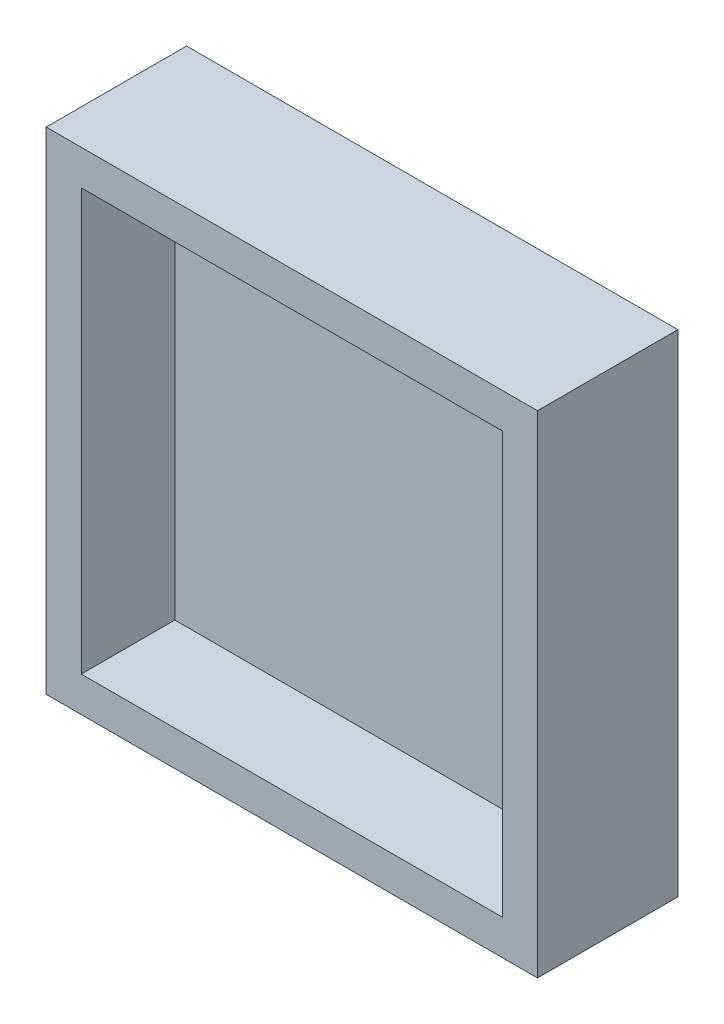
ISO-10303-21;
HEADER;
FILE_DESCRIPTION(('STEP AP214'),'2;1');
FILE_NAME('part.step','',(''),(''),'','','');
FILE_SCHEMA(('AUTOMOTIVE_DESIGN { 1 0 10303 214 1 1 1 1 }'));
ENDSEC;
DATA;
#1=APPLICATION_CONTEXT('core data for automotive mechanical design processes');
#2=APPLICATION_PROTOCOL_DEFINITION('international standard','automotive_design',2000,#1);
#3=PRODUCT_CONTEXT('',#1,'mechanical');
#4=PRODUCT('Part','Part','',(#3));
#5=PRODUCT_RELATED_PRODUCT_CATEGORY('part','',(#4));
#6=PRODUCT_DEFINITION_FORMATION('','',#4);
#7=PRODUCT_DEFINITION_CONTEXT('part definition',#1,'design');
#8=PRODUCT_DEFINITION('design','',#6,#7);
#9=PRODUCT_DEFINITION_SHAPE('','',#8);
#10=(LENGTH_UNIT() NAMED_UNIT(*) SI_UNIT(.MILLI.,.METRE.));
#11=(NAMED_UNIT(*) PLANE_ANGLE_UNIT() SI_UNIT($,.RADIAN.));
#12=(NAMED_UNIT(*) SI_UNIT($,.STERADIAN.) SOLID_ANGLE_UNIT());
#13=UNCERTAINTY_MEASURE_WITH_UNIT(LENGTH_MEASURE(1.E-05),#10,'distance_accuracy_value','');
#14=(GEOMETRIC_REPRESENTATION_CONTEXT(3) GLOBAL_UNCERTAINTY_ASSIGNED_CONTEXT((#13)) GLOBAL_UNIT_ASSIGNED_CONTEXT((#10,
#11,#12)) REPRESENTATION_CONTEXT('',''));
#15=CARTESIAN_POINT('',(0.,0.,0.));
#16=DIRECTION('',(0.,0.,1.));
#17=DIRECTION('',(1.,0.,0.));
#18=AXIS2_PLACEMENT_3D('',#15,#16,#17);
#19=CARTESIAN_POINT('',(-66.675,66.675,38.1));
#20=DIRECTION('',(0.,1.,0.));
#21=DIRECTION('',(0.,0.,1.));
#22=AXIS2_PLACEMENT_3D('',#19,#20,#21);
#23=PLANE('',#22);
#24=DIRECTION('',(1.,0.,0.));
#25=VECTOR('',#24,1.);
#26=CARTESIAN_POINT('',(-66.675,66.675,0.));
#27=LINE('',#26,#25);
#28=CARTESIAN_POINT('',(-66.675,66.675,0.));
#29=VERTEX_POINT('',#28);
#30=CARTESIAN_POINT('',(66.675,66.675,0.));
#31=VERTEX_POINT('',#30);
#32=EDGE_CURVE('E157',#29,#31,#27,.T.);
#33=ORIENTED_EDGE('',*,*,#32,.F.);
#34=DIRECTION('',(0.,0.,-1.));
#35=VECTOR('',#34,1.);
#36=CARTESIAN_POINT('',(-66.675,66.675,38.1));
#37=LINE('',#36,#35);
#38=CARTESIAN_POINT('',(-66.675,66.675,38.1));
#39=VERTEX_POINT('',#38);
#40=EDGE_CURVE('E11',#39,#29,#37,.T.);
#41=ORIENTED_EDGE('',*,*,#40,.F.);
#42=DIRECTION('',(1.,0.,0.));
#43=VECTOR('',#42,1.);
#44=CARTESIAN_POINT('',(-66.675,66.675,38.1));
#45=LINE('',#44,#43);
#46=CARTESIAN_POINT('',(66.675,66.675,38.1));
#47=VERTEX_POINT('',#46);
#48=EDGE_CURVE('E163',#39,#47,#45,.T.);
#49=ORIENTED_EDGE('',*,*,#48,.T.);
#50=DIRECTION('',(0.,0.,-1.));
#51=VECTOR('',#50,1.);
#52=CARTESIAN_POINT('',(66.675,66.675,38.1));
#53=LINE('',#52,#51);
#54=EDGE_CURVE('E42',#47,#31,#53,.T.);
#55=ORIENTED_EDGE('',*,*,#54,.T.);
#56=EDGE_LOOP('',(#33,#41,#49,#55));
#57=FACE_BOUND('',#56,.T.);
#58=ADVANCED_FACE('F39',(#57),#23,.T.);
#59=CARTESIAN_POINT('',(-66.675,-66.675,38.1));
#60=DIRECTION('',(-1.,0.,0.));
#61=DIRECTION('',(0.,0.,1.));
#62=AXIS2_PLACEMENT_3D('',#59,#60,#61);
#63=PLANE('',#62);
#64=DIRECTION('',(0.,1.,0.));
#65=VECTOR('',#64,1.);
#66=CARTESIAN_POINT('',(-66.675,-66.675,0.));
#67=LINE('',#66,#65);
#68=CARTESIAN_POINT('',(-66.675,-66.675,0.));
#69=VERTEX_POINT('',#68);
#70=EDGE_CURVE('E166',#69,#29,#67,.T.);
#71=ORIENTED_EDGE('',*,*,#70,.F.);
#72=DIRECTION('',(0.,0.,-1.));
#73=VECTOR('',#72,1.);
#74=CARTESIAN_POINT('',(-66.675,-66.675,38.1));
#75=LINE('',#74,#73);
#76=CARTESIAN_POINT('',(-66.675,-66.675,38.1));
#77=VERTEX_POINT('',#76);
#78=EDGE_CURVE('E48',#77,#69,#75,.T.);
#79=ORIENTED_EDGE('',*,*,#78,.F.);
#80=DIRECTION('',(0.,1.,0.));
#81=VECTOR('',#80,1.);
#82=CARTESIAN_POINT('',(-66.675,-66.675,38.1));
#83=LINE('',#82,#81);
#84=EDGE_CURVE('E172',#77,#39,#83,.T.);
#85=ORIENTED_EDGE('',*,*,#84,.T.);
#86=ORIENTED_EDGE('',*,*,#40,.T.);
#87=EDGE_LOOP('',(#71,#79,#85,#86));
#88=FACE_BOUND('',#87,.T.);
#89=ADVANCED_FACE('F200',(#88),#63,.T.);
#90=CARTESIAN_POINT('',(-66.675,-66.675,38.1));
#91=DIRECTION('',(0.,1.,0.));
#92=DIRECTION('',(0.,0.,1.));
#93=AXIS2_PLACEMENT_3D('',#90,#91,#92);
#94=PLANE('',#93);
#95=DIRECTION('',(1.,0.,0.));
#96=VECTOR('',#95,1.);
#97=CARTESIAN_POINT('',(-66.675,-66.675,0.));
#98=LINE('',#97,#96);
#99=CARTESIAN_POINT('',(66.675,-66.675,0.));
#100=VERTEX_POINT('',#99);
#101=EDGE_CURVE('E182',#69,#100,#98,.T.);
#102=ORIENTED_EDGE('',*,*,#101,.T.);
#103=DIRECTION('',(0.,0.,-1.));
#104=VECTOR('',#103,1.);
#105=CARTESIAN_POINT('',(66.675,-66.675,38.1));
#106=LINE('',#105,#104);
#107=CARTESIAN_POINT('',(66.675,-66.675,38.1));
#108=VERTEX_POINT('',#107);
#109=EDGE_CURVE('E189',#108,#100,#106,.T.);
#110=ORIENTED_EDGE('',*,*,#109,.F.);
#111=DIRECTION('',(1.,0.,0.));
#112=VECTOR('',#111,1.);
#113=CARTESIAN_POINT('',(-66.675,-66.675,38.1));
#114=LINE('',#113,#112);
#115=EDGE_CURVE('E169',#77,#108,#114,.T.);
#116=ORIENTED_EDGE('',*,*,#115,.F.);
#117=ORIENTED_EDGE('',*,*,#78,.T.);
#118=EDGE_LOOP('',(#102,#110,#116,#117));
#119=FACE_BOUND('',#118,.T.);
#120=ADVANCED_FACE('F204',(#119),#94,.F.);
#121=CARTESIAN_POINT('',(66.675,-66.675,38.1));
#122=DIRECTION('',(-1.,0.,0.));
#123=DIRECTION('',(0.,0.,1.));
#124=AXIS2_PLACEMENT_3D('',#121,#122,#123);
#125=PLANE('',#124);
#126=DIRECTION('',(0.,1.,0.));
#127=VECTOR('',#126,1.);
#128=CARTESIAN_POINT('',(66.675,-66.675,0.));
#129=LINE('',#128,#127);
#130=EDGE_CURVE('E178',#100,#31,#129,.T.);
#131=ORIENTED_EDGE('',*,*,#130,.T.);
#132=ORIENTED_EDGE('',*,*,#54,.F.);
#133=DIRECTION('',(0.,1.,0.));
#134=VECTOR('',#133,1.);
#135=CARTESIAN_POINT('',(66.675,-66.675,38.1));
#136=LINE('',#135,#134);
#137=EDGE_CURVE('E89',#108,#47,#136,.T.);
#138=ORIENTED_EDGE('',*,*,#137,.F.);
#139=ORIENTED_EDGE('',*,*,#109,.T.);
#140=EDGE_LOOP('',(#131,#132,#138,#139));
#141=FACE_BOUND('',#140,.T.);
#142=ADVANCED_FACE('F196',(#141),#125,.F.);
#143=CARTESIAN_POINT('',(0.,0.,38.1));
#144=DIRECTION('',(0.,0.,1.));
#145=DIRECTION('',(1.,0.,0.));
#146=AXIS2_PLACEMENT_3D('',#143,#144,#145);
#147=PLANE('',#146);
#148=DIRECTION('',(0.,1.,0.));
#149=VECTOR('',#148,1.);
#150=CARTESIAN_POINT('',(57.15,-57.15,38.1));
#151=LINE('',#150,#149);
#152=CARTESIAN_POINT('',(57.15,-57.15,38.1));
#153=VERTEX_POINT('',#152);
#154=CARTESIAN_POINT('',(57.15,57.15,38.1));
#155=VERTEX_POINT('',#154);
#156=EDGE_CURVE('E56',#153,#155,#151,.T.);
#157=ORIENTED_EDGE('',*,*,#156,.F.);
#158=DIRECTION('',(1.,0.,0.));
#159=VECTOR('',#158,1.);
#160=CARTESIAN_POINT('',(-57.15,-57.15,38.1));
#161=LINE('',#160,#159);
#162=CARTESIAN_POINT('',(-57.15,-57.15,38.1));
#163=VERTEX_POINT('',#162);
#164=EDGE_CURVE('E135',#163,#153,#161,.T.);
#165=ORIENTED_EDGE('',*,*,#164,.F.);
#166=DIRECTION('',(0.,-1.,0.));
#167=VECTOR('',#166,1.);
#168=CARTESIAN_POINT('',(-57.15,-57.15,38.1));
#169=LINE('',#168,#167);
#170=CARTESIAN_POINT('',(-57.15,57.15,38.1));
#171=VERTEX_POINT('',#170);
#172=EDGE_CURVE('E139',#171,#163,#169,.T.);
#173=ORIENTED_EDGE('',*,*,#172,.F.);
#174=DIRECTION('',(-1.,0.,0.));
#175=VECTOR('',#174,1.);
#176=CARTESIAN_POINT('',(-57.15,57.15,38.1));
#177=LINE('',#176,#175);
#178=EDGE_CURVE('E148',#155,#171,#177,.T.);
#179=ORIENTED_EDGE('',*,*,#178,.F.);
#180=EDGE_LOOP('',(#157,#165,#173,#179));
#181=FACE_BOUND('',#180,.T.);
#182=ORIENTED_EDGE('',*,*,#48,.F.);
#183=ORIENTED_EDGE('',*,*,#84,.F.);
#184=ORIENTED_EDGE('',*,*,#115,.T.);
#185=ORIENTED_EDGE('',*,*,#137,.T.);
#186=EDGE_LOOP('',(#182,#183,#184,#185));
#187=FACE_BOUND('',#186,.T.);
#188=ADVANCED_FACE('F205',(#181,#187),#147,.T.);
#189=CARTESIAN_POINT('',(0.,0.,0.));
#190=DIRECTION('',(0.,0.,1.));
#191=DIRECTION('',(1.,0.,0.));
#192=AXIS2_PLACEMENT_3D('',#189,#190,#191);
#193=PLANE('',#192);
#194=ORIENTED_EDGE('',*,*,#32,.T.);
#195=ORIENTED_EDGE('',*,*,#130,.F.);
#196=ORIENTED_EDGE('',*,*,#101,.F.);
#197=ORIENTED_EDGE('',*,*,#70,.T.);
#198=EDGE_LOOP('',(#194,#195,#196,#197));
#199=FACE_BOUND('',#198,.T.);
#200=ADVANCED_FACE('F199',(#199),#193,.F.);
#201=CARTESIAN_POINT('',(57.15,-57.15,12.7));
#202=DIRECTION('',(1.,0.,0.));
#203=DIRECTION('',(0.,0.,-1.));
#204=AXIS2_PLACEMENT_3D('',#201,#202,#203);
#205=PLANE('',#204);
#206=ORIENTED_EDGE('',*,*,#156,.T.);
#207=DIRECTION('',(0.,0.,1.));
#208=VECTOR('',#207,1.);
#209=CARTESIAN_POINT('',(57.15,57.15,12.7));
#210=LINE('',#209,#208);
#211=CARTESIAN_POINT('',(57.15,57.15,12.7));
#212=VERTEX_POINT('',#211);
#213=EDGE_CURVE('E110',#212,#155,#210,.T.);
#214=ORIENTED_EDGE('',*,*,#213,.F.);
#215=DIRECTION('',(0.,1.,0.));
#216=VECTOR('',#215,1.);
#217=CARTESIAN_POINT('',(57.15,-57.15,12.7));
#218=LINE('',#217,#216);
#219=CARTESIAN_POINT('',(57.15,-57.15,12.7));
#220=VERTEX_POINT('',#219);
#221=EDGE_CURVE('E114',#220,#212,#218,.T.);
#222=ORIENTED_EDGE('',*,*,#221,.F.);
#223=DIRECTION('',(0.,0.,1.));
#224=VECTOR('',#223,1.);
#225=CARTESIAN_POINT('',(57.15,-57.15,12.7));
#226=LINE('',#225,#224);
#227=EDGE_CURVE('E154',#220,#153,#226,.T.);
#228=ORIENTED_EDGE('',*,*,#227,.T.);
#229=EDGE_LOOP('',(#206,#214,#222,#228));
#230=FACE_BOUND('',#229,.T.);
#231=ADVANCED_FACE('F112',(#230),#205,.F.);
#232=CARTESIAN_POINT('',(-57.15,-57.15,12.7));
#233=DIRECTION('',(0.,-1.,0.));
#234=DIRECTION('',(0.,0.,-1.));
#235=AXIS2_PLACEMENT_3D('',#232,#233,#234);
#236=PLANE('',#235);
#237=ORIENTED_EDGE('',*,*,#164,.T.);
#238=ORIENTED_EDGE('',*,*,#227,.F.);
#239=DIRECTION('',(1.,0.,0.));
#240=VECTOR('',#239,1.);
#241=CARTESIAN_POINT('',(-57.15,-57.15,12.7));
#242=LINE('',#241,#240);
#243=CARTESIAN_POINT('',(-57.15,-57.15,12.7));
#244=VERTEX_POINT('',#243);
#245=EDGE_CURVE('E121',#244,#220,#242,.T.);
#246=ORIENTED_EDGE('',*,*,#245,.F.);
#247=DIRECTION('',(0.,0.,1.));
#248=VECTOR('',#247,1.);
#249=CARTESIAN_POINT('',(-57.15,-57.15,12.7));
#250=LINE('',#249,#248);
#251=EDGE_CURVE('E158',#244,#163,#250,.T.);
#252=ORIENTED_EDGE('',*,*,#251,.T.);
#253=EDGE_LOOP('',(#237,#238,#246,#252));
#254=FACE_BOUND('',#253,.T.);
#255=ADVANCED_FACE('F249',(#254),#236,.F.);
#256=CARTESIAN_POINT('',(-57.15,-57.15,12.7));
#257=DIRECTION('',(-1.,0.,0.));
#258=DIRECTION('',(0.,0.,1.));
#259=AXIS2_PLACEMENT_3D('',#256,#257,#258);
#260=PLANE('',#259);
#261=ORIENTED_EDGE('',*,*,#172,.T.);
#262=ORIENTED_EDGE('',*,*,#251,.F.);
#263=DIRECTION('',(0.,-1.,0.));
#264=VECTOR('',#263,1.);
#265=CARTESIAN_POINT('',(-57.15,-57.15,12.7));
#266=LINE('',#265,#264);
#267=CARTESIAN_POINT('',(-57.15,57.15,12.7));
#268=VERTEX_POINT('',#267);
#269=EDGE_CURVE('E130',#268,#244,#266,.T.);
#270=ORIENTED_EDGE('',*,*,#269,.F.);
#271=DIRECTION('',(0.,0.,1.));
#272=VECTOR('',#271,1.);
#273=CARTESIAN_POINT('',(-57.15,57.15,12.7));
#274=LINE('',#273,#272);
#275=EDGE_CURVE('E120',#268,#171,#274,.T.);
#276=ORIENTED_EDGE('',*,*,#275,.T.);
#277=EDGE_LOOP('',(#261,#262,#270,#276));
#278=FACE_BOUND('',#277,.T.);
#279=ADVANCED_FACE('F257',(#278),#260,.F.);
#280=CARTESIAN_POINT('',(-57.15,57.15,12.7));
#281=DIRECTION('',(0.,1.,0.));
#282=DIRECTION('',(0.,0.,1.));
#283=AXIS2_PLACEMENT_3D('',#280,#281,#282);
#284=PLANE('',#283);
#285=ORIENTED_EDGE('',*,*,#178,.T.);
#286=ORIENTED_EDGE('',*,*,#275,.F.);
#287=DIRECTION('',(-1.,0.,0.));
#288=VECTOR('',#287,1.);
#289=CARTESIAN_POINT('',(-57.15,57.15,12.7));
#290=LINE('',#289,#288);
#291=EDGE_CURVE('E124',#212,#268,#290,.T.);
#292=ORIENTED_EDGE('',*,*,#291,.F.);
#293=ORIENTED_EDGE('',*,*,#213,.T.);
#294=EDGE_LOOP('',(#285,#286,#292,#293));
#295=FACE_BOUND('',#294,.T.);
#296=ADVANCED_FACE('F125',(#295),#284,.F.);
#297=CARTESIAN_POINT('',(0.,0.,12.7));
#298=DIRECTION('',(0.,0.,-1.));
#299=DIRECTION('',(-1.,0.,0.));
#300=AXIS2_PLACEMENT_3D('',#297,#298,#299);
#301=PLANE('',#300);
#302=ORIENTED_EDGE('',*,*,#221,.T.);
#303=ORIENTED_EDGE('',*,*,#291,.T.);
#304=ORIENTED_EDGE('',*,*,#269,.T.);
#305=ORIENTED_EDGE('',*,*,#245,.T.);
#306=EDGE_LOOP('',(#302,#303,#304,#305));
#307=FACE_BOUND('',#306,.T.);
#308=ADVANCED_FACE('F132',(#307),#301,.F.);
#309=CLOSED_SHELL('',(#58,#89,#120,#142,#188,#200,#231,#255,#279,#296,#308));
#310=MANIFOLD_SOLID_BREP('B2',#309);
#311=ADVANCED_BREP_SHAPE_REPRESENTATION('',(#18,#310),#14);
#312=SHAPE_DEFINITION_REPRESENTATION(#9,#311);
ENDSEC;
END-ISO-10303-21;
